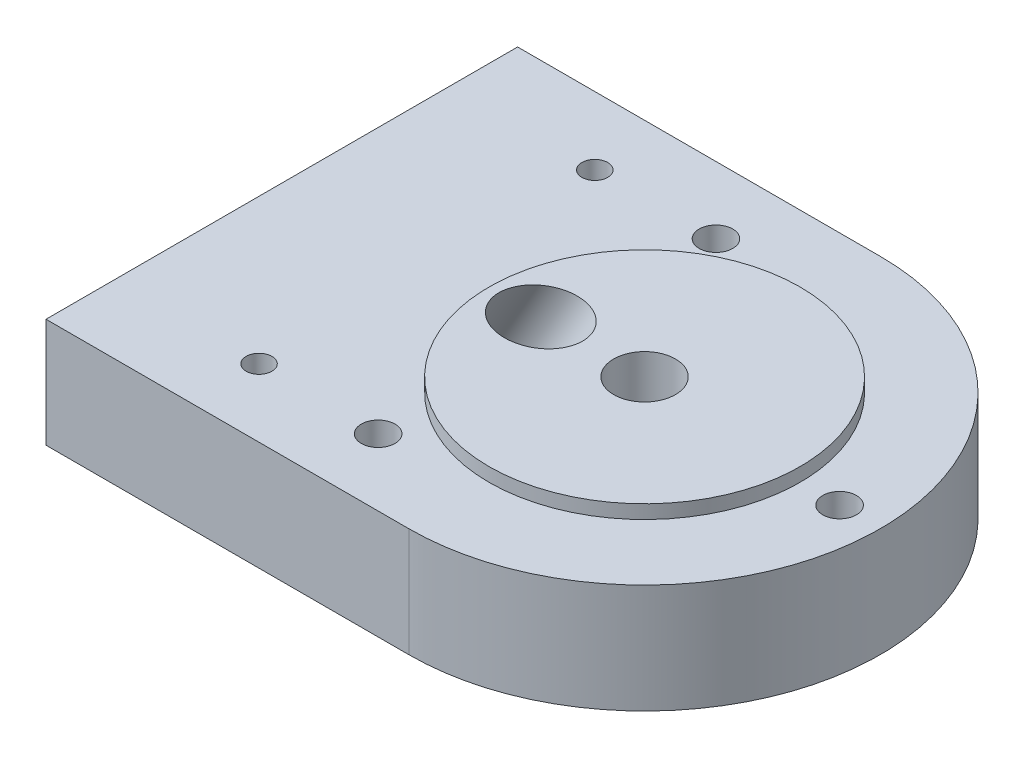
ISO-10303-21;
HEADER;
FILE_DESCRIPTION(('STEP AP214'),'2;1');
FILE_NAME('part.step','',(''),(''),'','','');
FILE_SCHEMA(('AUTOMOTIVE_DESIGN { 1 0 10303 214 1 1 1 1 }'));
ENDSEC;
DATA;
#1=APPLICATION_CONTEXT('core data for automotive mechanical design processes');
#2=APPLICATION_PROTOCOL_DEFINITION('international standard','automotive_design',2000,#1);
#3=PRODUCT_CONTEXT('',#1,'mechanical');
#4=PRODUCT('Part','Part','',(#3));
#5=PRODUCT_RELATED_PRODUCT_CATEGORY('part','',(#4));
#6=PRODUCT_DEFINITION_FORMATION('','',#4);
#7=PRODUCT_DEFINITION_CONTEXT('part definition',#1,'design');
#8=PRODUCT_DEFINITION('design','',#6,#7);
#9=PRODUCT_DEFINITION_SHAPE('','',#8);
#10=(LENGTH_UNIT() NAMED_UNIT(*) SI_UNIT(.MILLI.,.METRE.));
#11=(NAMED_UNIT(*) PLANE_ANGLE_UNIT() SI_UNIT($,.RADIAN.));
#12=(NAMED_UNIT(*) SI_UNIT($,.STERADIAN.) SOLID_ANGLE_UNIT());
#13=UNCERTAINTY_MEASURE_WITH_UNIT(LENGTH_MEASURE(1.E-05),#10,'distance_accuracy_value','');
#14=(GEOMETRIC_REPRESENTATION_CONTEXT(3) GLOBAL_UNCERTAINTY_ASSIGNED_CONTEXT((#13)) GLOBAL_UNIT_ASSIGNED_CONTEXT((#10,
#11,#12)) REPRESENTATION_CONTEXT('',''));
#15=CARTESIAN_POINT('',(0.,0.,0.));
#16=DIRECTION('',(0.,0.,1.));
#17=DIRECTION('',(1.,0.,0.));
#18=AXIS2_PLACEMENT_3D('',#15,#16,#17);
#19=CARTESIAN_POINT('',(31.7499999999999,0.,-20.6375));
#20=DIRECTION('',(0.,-1.,0.));
#21=DIRECTION('',(0.,0.,-1.));
#22=AXIS2_PLACEMENT_3D('',#19,#20,#21);
#23=CYLINDRICAL_SURFACE('',#22,2.7051);
#24=CARTESIAN_POINT('',(31.7499999999999,10.7442,-20.6375));
#25=DIRECTION('',(0.,-1.,0.));
#26=DIRECTION('',(0.,0.,-1.));
#27=AXIS2_PLACEMENT_3D('',#24,#25,#26);
#28=CIRCLE('',#27,2.70509999999999);
#29=CARTESIAN_POINT('',(31.7499999999999,10.7442,-23.3426));
#30=VERTEX_POINT('',#29);
#31=EDGE_CURVE('E129',#30,#30,#28,.T.);
#32=ORIENTED_EDGE('',*,*,#31,.F.);
#33=EDGE_LOOP('',(#32));
#34=FACE_BOUND('',#33,.T.);
#35=CARTESIAN_POINT('',(31.7499999999999,3.175,-20.6375));
#36=DIRECTION('',(0.,-1.,0.));
#37=DIRECTION('',(0.,0.,-1.));
#38=AXIS2_PLACEMENT_3D('',#35,#36,#37);
#39=CIRCLE('',#38,2.7051);
#40=CARTESIAN_POINT('',(31.7499999999999,3.175,-23.3426));
#41=VERTEX_POINT('',#40);
#42=EDGE_CURVE('E43',#41,#41,#39,.F.);
#43=ORIENTED_EDGE('',*,*,#42,.F.);
#44=EDGE_LOOP('',(#43));
#45=FACE_BOUND('',#44,.T.);
#46=ADVANCED_FACE('F39',(#34,#45),#23,.F.);
#47=CARTESIAN_POINT('',(0.,9.5504,0.));
#48=DIRECTION('',(1.,0.,0.));
#49=DIRECTION('',(0.,0.,-1.));
#50=AXIS2_PLACEMENT_3D('',#47,#48,#49);
#51=PLANE('',#50);
#52=CARTESIAN_POINT('',(0.,4.7752,-12.7));
#53=DIRECTION('',(-1.,0.,0.));
#54=DIRECTION('',(0.,0.,1.));
#55=AXIS2_PLACEMENT_3D('',#52,#53,#54);
#56=CIRCLE('',#55,1.35254999999999);
#57=CARTESIAN_POINT('',(0.,4.7752,-11.34745));
#58=VERTEX_POINT('',#57);
#59=EDGE_CURVE('E108',#58,#58,#56,.T.);
#60=ORIENTED_EDGE('',*,*,#59,.F.);
#61=EDGE_LOOP('',(#60));
#62=FACE_BOUND('',#61,.T.);
#63=CARTESIAN_POINT('',(0.,4.7752,-28.575));
#64=DIRECTION('',(-1.,0.,0.));
#65=DIRECTION('',(0.,0.,1.));
#66=AXIS2_PLACEMENT_3D('',#63,#64,#65);
#67=CIRCLE('',#66,1.35254999999999);
#68=CARTESIAN_POINT('',(0.,4.7752,-27.22245));
#69=VERTEX_POINT('',#68);
#70=EDGE_CURVE('E107',#69,#69,#67,.T.);
#71=ORIENTED_EDGE('',*,*,#70,.F.);
#72=EDGE_LOOP('',(#71));
#73=FACE_BOUND('',#72,.T.);
#74=DIRECTION('',(0.,0.,1.));
#75=VECTOR('',#74,1.);
#76=CARTESIAN_POINT('',(0.,0.,0.));
#77=LINE('',#76,#75);
#78=CARTESIAN_POINT('',(0.,0.,-41.275));
#79=VERTEX_POINT('',#78);
#80=CARTESIAN_POINT('',(0.,0.,0.));
#81=VERTEX_POINT('',#80);
#82=EDGE_CURVE('E162',#79,#81,#77,.T.);
#83=ORIENTED_EDGE('',*,*,#82,.T.);
#84=DIRECTION('',(0.,-1.,0.));
#85=VECTOR('',#84,1.);
#86=CARTESIAN_POINT('',(0.,9.5504,0.));
#87=LINE('',#86,#85);
#88=CARTESIAN_POINT('',(0.,9.5504,0.));
#89=VERTEX_POINT('',#88);
#90=EDGE_CURVE('E49',#89,#81,#87,.T.);
#91=ORIENTED_EDGE('',*,*,#90,.F.);
#92=DIRECTION('',(0.,0.,1.));
#93=VECTOR('',#92,1.);
#94=CARTESIAN_POINT('',(0.,9.5504,0.));
#95=LINE('',#94,#93);
#96=CARTESIAN_POINT('',(0.,9.5504,-41.275));
#97=VERTEX_POINT('',#96);
#98=EDGE_CURVE('E164',#97,#89,#95,.T.);
#99=ORIENTED_EDGE('',*,*,#98,.F.);
#100=DIRECTION('',(0.,-1.,0.));
#101=VECTOR('',#100,1.);
#102=CARTESIAN_POINT('',(0.,9.5504,-41.275));
#103=LINE('',#102,#101);
#104=EDGE_CURVE('E170',#97,#79,#103,.T.);
#105=ORIENTED_EDGE('',*,*,#104,.T.);
#106=EDGE_LOOP('',(#83,#91,#99,#105));
#107=FACE_BOUND('',#106,.T.);
#108=ADVANCED_FACE('F41',(#62,#73,#107),#51,.F.);
#109=CARTESIAN_POINT('',(0.,9.5504,0.));
#110=DIRECTION('',(0.,0.,-1.));
#111=DIRECTION('',(-1.,0.,0.));
#112=AXIS2_PLACEMENT_3D('',#109,#110,#111);
#113=PLANE('',#112);
#114=DIRECTION('',(1.,0.,0.));
#115=VECTOR('',#114,1.);
#116=CARTESIAN_POINT('',(0.,0.,0.));
#117=LINE('',#116,#115);
#118=CARTESIAN_POINT('',(31.75,0.,0.));
#119=VERTEX_POINT('',#118);
#120=EDGE_CURVE('E173',#81,#119,#117,.T.);
#121=ORIENTED_EDGE('',*,*,#120,.T.);
#122=DIRECTION('',(0.,-1.,0.));
#123=VECTOR('',#122,1.);
#124=CARTESIAN_POINT('',(31.75,9.5504,0.));
#125=LINE('',#124,#123);
#126=CARTESIAN_POINT('',(31.75,9.5504,0.));
#127=VERTEX_POINT('',#126);
#128=EDGE_CURVE('E180',#127,#119,#125,.T.);
#129=ORIENTED_EDGE('',*,*,#128,.F.);
#130=DIRECTION('',(1.,0.,0.));
#131=VECTOR('',#130,1.);
#132=CARTESIAN_POINT('',(0.,9.5504,0.));
#133=LINE('',#132,#131);
#134=EDGE_CURVE('E90',#89,#127,#133,.T.);
#135=ORIENTED_EDGE('',*,*,#134,.F.);
#136=ORIENTED_EDGE('',*,*,#90,.T.);
#137=EDGE_LOOP('',(#121,#129,#135,#136));
#138=FACE_BOUND('',#137,.T.);
#139=ADVANCED_FACE('F200',(#138),#113,.F.);
#140=CARTESIAN_POINT('',(31.75,9.5504,-20.6375));
#141=DIRECTION('',(0.,-1.,0.));
#142=DIRECTION('',(0.,0.,-1.));
#143=AXIS2_PLACEMENT_3D('',#140,#141,#142);
#144=CYLINDRICAL_SURFACE('',#143,20.6375);
#145=CARTESIAN_POINT('',(31.75,0.,-20.6375));
#146=DIRECTION('',(0.,1.,0.));
#147=DIRECTION('',(0.,0.,-1.));
#148=AXIS2_PLACEMENT_3D('',#145,#146,#147);
#149=CIRCLE('',#148,20.6375);
#150=CARTESIAN_POINT('',(31.75,0.,-41.275));
#151=VERTEX_POINT('',#150);
#152=EDGE_CURVE('E76',#119,#151,#149,.T.);
#153=ORIENTED_EDGE('',*,*,#152,.T.);
#154=DIRECTION('',(0.,-1.,0.));
#155=VECTOR('',#154,1.);
#156=CARTESIAN_POINT('',(31.75,9.5504,-41.275));
#157=LINE('',#156,#155);
#158=CARTESIAN_POINT('',(31.75,9.5504,-41.275));
#159=VERTEX_POINT('',#158);
#160=EDGE_CURVE('E178',#159,#151,#157,.T.);
#161=ORIENTED_EDGE('',*,*,#160,.F.);
#162=CARTESIAN_POINT('',(31.75,9.5504,-20.6375));
#163=DIRECTION('',(0.,1.,0.));
#164=DIRECTION('',(0.,0.,-1.));
#165=AXIS2_PLACEMENT_3D('',#162,#163,#164);
#166=CIRCLE('',#165,20.6375);
#167=EDGE_CURVE('E167',#127,#159,#166,.T.);
#168=ORIENTED_EDGE('',*,*,#167,.F.);
#169=ORIENTED_EDGE('',*,*,#128,.T.);
#170=EDGE_LOOP('',(#153,#161,#168,#169));
#171=FACE_BOUND('',#170,.T.);
#172=ADVANCED_FACE('F246',(#171),#144,.T.);
#173=CARTESIAN_POINT('',(0.,9.5504,-41.275));
#174=DIRECTION('',(0.,0.,1.));
#175=DIRECTION('',(1.,0.,0.));
#176=AXIS2_PLACEMENT_3D('',#173,#174,#175);
#177=PLANE('',#176);
#178=DIRECTION('',(-1.,0.,0.));
#179=VECTOR('',#178,1.);
#180=CARTESIAN_POINT('',(0.,0.,-41.275));
#181=LINE('',#180,#179);
#182=EDGE_CURVE('E82',#151,#79,#181,.T.);
#183=ORIENTED_EDGE('',*,*,#182,.T.);
#184=ORIENTED_EDGE('',*,*,#104,.F.);
#185=DIRECTION('',(-1.,0.,0.));
#186=VECTOR('',#185,1.);
#187=CARTESIAN_POINT('',(0.,9.5504,-41.275));
#188=LINE('',#187,#186);
#189=EDGE_CURVE('E58',#159,#97,#188,.T.);
#190=ORIENTED_EDGE('',*,*,#189,.F.);
#191=ORIENTED_EDGE('',*,*,#160,.T.);
#192=EDGE_LOOP('',(#183,#184,#190,#191));
#193=FACE_BOUND('',#192,.T.);
#194=ADVANCED_FACE('F239',(#193),#177,.F.);
#195=CARTESIAN_POINT('',(31.75,9.5504,-20.6375));
#196=DIRECTION('',(0.,-1.,0.));
#197=DIRECTION('',(0.,0.,-1.));
#198=AXIS2_PLACEMENT_3D('',#195,#196,#197);
#199=PLANE('',#198);
#200=CARTESIAN_POINT('',(12.7,9.5504,-5.9436));
#201=DIRECTION('',(0.,-1.,0.));
#202=DIRECTION('',(0.,0.,-1.));
#203=AXIS2_PLACEMENT_3D('',#200,#201,#202);
#204=CIRCLE('',#203,1.1303);
#205=CARTESIAN_POINT('',(12.7,9.5504,-7.0739));
#206=VERTEX_POINT('',#205);
#207=EDGE_CURVE('E135',#206,#206,#204,.T.);
#208=ORIENTED_EDGE('',*,*,#207,.T.);
#209=EDGE_LOOP('',(#208));
#210=FACE_BOUND('',#209,.T.);
#211=CARTESIAN_POINT('',(12.7,9.5504,-35.3314));
#212=DIRECTION('',(0.,-1.,0.));
#213=DIRECTION('',(0.,0.,-1.));
#214=AXIS2_PLACEMENT_3D('',#211,#212,#213);
#215=CIRCLE('',#214,1.1303);
#216=CARTESIAN_POINT('',(12.7,9.5504,-36.4617));
#217=VERTEX_POINT('',#216);
#218=EDGE_CURVE('E139',#217,#217,#215,.T.);
#219=ORIENTED_EDGE('',*,*,#218,.T.);
#220=EDGE_LOOP('',(#219));
#221=FACE_BOUND('',#220,.T.);
#222=CARTESIAN_POINT('',(23.2156,9.5504,-35.4203));
#223=DIRECTION('',(0.,-1.,0.));
#224=DIRECTION('',(0.,0.,-1.));
#225=AXIS2_PLACEMENT_3D('',#222,#223,#224);
#226=CIRCLE('',#225,1.4732);
#227=CARTESIAN_POINT('',(23.2156,9.5504,-36.8935));
#228=VERTEX_POINT('',#227);
#229=EDGE_CURVE('E157',#228,#228,#226,.T.);
#230=ORIENTED_EDGE('',*,*,#229,.T.);
#231=EDGE_LOOP('',(#230));
#232=FACE_BOUND('',#231,.T.);
#233=CARTESIAN_POINT('',(48.8188,9.5504,-20.6375));
#234=DIRECTION('',(0.,-1.,0.));
#235=DIRECTION('',(0.,0.,-1.));
#236=AXIS2_PLACEMENT_3D('',#233,#234,#235);
#237=CIRCLE('',#236,1.4732);
#238=CARTESIAN_POINT('',(48.8188,9.5504,-22.1107));
#239=VERTEX_POINT('',#238);
#240=EDGE_CURVE('E154',#239,#239,#237,.T.);
#241=ORIENTED_EDGE('',*,*,#240,.T.);
#242=EDGE_LOOP('',(#241));
#243=FACE_BOUND('',#242,.T.);
#244=CARTESIAN_POINT('',(23.2156,9.5504,-5.8547));
#245=DIRECTION('',(0.,-1.,0.));
#246=DIRECTION('',(0.,0.,-1.));
#247=AXIS2_PLACEMENT_3D('',#244,#245,#246);
#248=CIRCLE('',#247,1.4732);
#249=CARTESIAN_POINT('',(23.2156,9.5504,-7.3279));
#250=VERTEX_POINT('',#249);
#251=EDGE_CURVE('E146',#250,#250,#248,.T.);
#252=ORIENTED_EDGE('',*,*,#251,.T.);
#253=EDGE_LOOP('',(#252));
#254=FACE_BOUND('',#253,.T.);
#255=CARTESIAN_POINT('',(31.75,9.5504,-20.6375));
#256=DIRECTION('',(0.,1.,0.));
#257=DIRECTION('',(0.,0.,1.));
#258=AXIS2_PLACEMENT_3D('',#255,#256,#257);
#259=CIRCLE('',#258,13.6144);
#260=CARTESIAN_POINT('',(31.75,9.5504,-7.0231));
#261=VERTEX_POINT('',#260);
#262=EDGE_CURVE('E11',#261,#261,#259,.T.);
#263=ORIENTED_EDGE('',*,*,#262,.F.);
#264=EDGE_LOOP('',(#263));
#265=FACE_BOUND('',#264,.T.);
#266=ORIENTED_EDGE('',*,*,#98,.T.);
#267=ORIENTED_EDGE('',*,*,#134,.T.);
#268=ORIENTED_EDGE('',*,*,#167,.T.);
#269=ORIENTED_EDGE('',*,*,#189,.T.);
#270=EDGE_LOOP('',(#266,#267,#268,#269));
#271=FACE_BOUND('',#270,.T.);
#272=ADVANCED_FACE('F236',(#210,#221,#232,#243,#254,#265,#271),#199,.F.);
#273=CARTESIAN_POINT('',(31.75,0.,-20.6375));
#274=DIRECTION('',(0.,-1.,0.));
#275=DIRECTION('',(0.,0.,-1.));
#276=AXIS2_PLACEMENT_3D('',#273,#274,#275);
#277=PLANE('',#276);
#278=CARTESIAN_POINT('',(16.4638029065819,0.,-20.6375));
#279=DIRECTION('',(0.,-1.,0.));
#280=DIRECTION('',(-1.,0.,0.));
#281=AXIS2_PLACEMENT_3D('',#278,#279,#280);
#282=ELLIPSE('',#281,3.66617420935412,3.175);
#283=CARTESIAN_POINT('',(12.7976286972278,0.,-20.6375));
#284=VERTEX_POINT('',#283);
#285=EDGE_CURVE('E122',#284,#284,#282,.F.);
#286=ORIENTED_EDGE('',*,*,#285,.T.);
#287=EDGE_LOOP('',(#286));
#288=FACE_BOUND('',#287,.T.);
#289=CARTESIAN_POINT('',(31.7499999999999,0.,-20.6375));
#290=DIRECTION('',(0.,-1.,0.));
#291=DIRECTION('',(0.,0.,-1.));
#292=AXIS2_PLACEMENT_3D('',#289,#290,#291);
#293=CIRCLE('',#292,3.683);
#294=CARTESIAN_POINT('',(31.7499999999999,0.,-24.3205));
#295=VERTEX_POINT('',#294);
#296=EDGE_CURVE('E125',#295,#295,#293,.T.);
#297=ORIENTED_EDGE('',*,*,#296,.F.);
#298=EDGE_LOOP('',(#297));
#299=FACE_BOUND('',#298,.T.);
#300=CARTESIAN_POINT('',(12.7,0.,-5.9436));
#301=DIRECTION('',(0.,-1.,0.));
#302=DIRECTION('',(0.,0.,-1.));
#303=AXIS2_PLACEMENT_3D('',#300,#301,#302);
#304=CIRCLE('',#303,1.1303);
#305=CARTESIAN_POINT('',(12.7,0.,-7.0739));
#306=VERTEX_POINT('',#305);
#307=EDGE_CURVE('E132',#306,#306,#304,.T.);
#308=ORIENTED_EDGE('',*,*,#307,.F.);
#309=EDGE_LOOP('',(#308));
#310=FACE_BOUND('',#309,.T.);
#311=CARTESIAN_POINT('',(12.7,0.,-35.3314));
#312=DIRECTION('',(0.,-1.,0.));
#313=DIRECTION('',(0.,0.,-1.));
#314=AXIS2_PLACEMENT_3D('',#311,#312,#313);
#315=CIRCLE('',#314,1.1303);
#316=CARTESIAN_POINT('',(12.7,0.,-36.4617));
#317=VERTEX_POINT('',#316);
#318=EDGE_CURVE('E136',#317,#317,#315,.T.);
#319=ORIENTED_EDGE('',*,*,#318,.F.);
#320=EDGE_LOOP('',(#319));
#321=FACE_BOUND('',#320,.T.);
#322=CARTESIAN_POINT('',(23.2156,0.,-35.4203));
#323=DIRECTION('',(0.,1.,0.));
#324=DIRECTION('',(0.,0.,1.));
#325=AXIS2_PLACEMENT_3D('',#322,#323,#324);
#326=CIRCLE('',#325,1.4732);
#327=CARTESIAN_POINT('',(23.2156,0.,-33.9471));
#328=VERTEX_POINT('',#327);
#329=EDGE_CURVE('E143',#328,#328,#326,.T.);
#330=ORIENTED_EDGE('',*,*,#329,.T.);
#331=EDGE_LOOP('',(#330));
#332=FACE_BOUND('',#331,.T.);
#333=CARTESIAN_POINT('',(48.8188,0.,-20.6375));
#334=DIRECTION('',(0.,1.,0.));
#335=DIRECTION('',(0.,0.,1.));
#336=AXIS2_PLACEMENT_3D('',#333,#334,#335);
#337=CIRCLE('',#336,1.4732);
#338=CARTESIAN_POINT('',(48.8188,0.,-19.1643));
#339=VERTEX_POINT('',#338);
#340=EDGE_CURVE('E147',#339,#339,#337,.T.);
#341=ORIENTED_EDGE('',*,*,#340,.T.);
#342=EDGE_LOOP('',(#341));
#343=FACE_BOUND('',#342,.T.);
#344=CARTESIAN_POINT('',(23.2156,0.,-5.8547));
#345=DIRECTION('',(0.,1.,0.));
#346=DIRECTION('',(0.,0.,1.));
#347=AXIS2_PLACEMENT_3D('',#344,#345,#346);
#348=CIRCLE('',#347,1.4732);
#349=CARTESIAN_POINT('',(23.2156,0.,-4.3815));
#350=VERTEX_POINT('',#349);
#351=EDGE_CURVE('E142',#350,#350,#348,.T.);
#352=ORIENTED_EDGE('',*,*,#351,.T.);
#353=EDGE_LOOP('',(#352));
#354=FACE_BOUND('',#353,.T.);
#355=ORIENTED_EDGE('',*,*,#82,.F.);
#356=ORIENTED_EDGE('',*,*,#182,.F.);
#357=ORIENTED_EDGE('',*,*,#152,.F.);
#358=ORIENTED_EDGE('',*,*,#120,.F.);
#359=EDGE_LOOP('',(#355,#356,#357,#358));
#360=FACE_BOUND('',#359,.T.);
#361=ADVANCED_FACE('F234',(#288,#299,#310,#321,#332,#343,#354,#360),#277,.T.);
#362=CARTESIAN_POINT('',(31.75,10.7442,-20.6375));
#363=DIRECTION('',(0.,-1.,0.));
#364=DIRECTION('',(0.,0.,-1.));
#365=AXIS2_PLACEMENT_3D('',#362,#363,#364);
#366=CYLINDRICAL_SURFACE('',#365,13.6144);
#367=CARTESIAN_POINT('',(31.75,10.7442,-20.6375));
#368=DIRECTION('',(0.,1.,0.));
#369=DIRECTION('',(0.,0.,1.));
#370=AXIS2_PLACEMENT_3D('',#367,#368,#369);
#371=CIRCLE('',#370,13.6144);
#372=CARTESIAN_POINT('',(31.75,10.7442,-7.0231));
#373=VERTEX_POINT('',#372);
#374=EDGE_CURVE('E160',#373,#373,#371,.T.);
#375=ORIENTED_EDGE('',*,*,#374,.F.);
#376=EDGE_LOOP('',(#375));
#377=FACE_BOUND('',#376,.T.);
#378=ORIENTED_EDGE('',*,*,#262,.T.);
#379=EDGE_LOOP('',(#378));
#380=FACE_BOUND('',#379,.T.);
#381=ADVANCED_FACE('F230',(#377,#380),#366,.T.);
#382=CARTESIAN_POINT('',(31.75,10.7442,-20.6375));
#383=DIRECTION('',(0.,1.,0.));
#384=DIRECTION('',(0.,0.,1.));
#385=AXIS2_PLACEMENT_3D('',#382,#383,#384);
#386=PLANE('',#385);
#387=CARTESIAN_POINT('',(22.666969668809,10.7442,-20.6375));
#388=DIRECTION('',(0.,1.,0.));
#389=DIRECTION('',(-1.,0.,0.));
#390=AXIS2_PLACEMENT_3D('',#387,#388,#389);
#391=ELLIPSE('',#390,3.66617420935412,3.175);
#392=CARTESIAN_POINT('',(19.0007954594549,10.7442,-20.6375));
#393=VERTEX_POINT('',#392);
#394=EDGE_CURVE('E126',#393,#393,#391,.F.);
#395=ORIENTED_EDGE('',*,*,#394,.T.);
#396=EDGE_LOOP('',(#395));
#397=FACE_BOUND('',#396,.T.);
#398=ORIENTED_EDGE('',*,*,#31,.T.);
#399=EDGE_LOOP('',(#398));
#400=FACE_BOUND('',#399,.T.);
#401=ORIENTED_EDGE('',*,*,#374,.T.);
#402=EDGE_LOOP('',(#401));
#403=FACE_BOUND('',#402,.T.);
#404=ADVANCED_FACE('F226',(#397,#400,#403),#386,.T.);
#405=CARTESIAN_POINT('',(23.2156,0.,-5.8547));
#406=DIRECTION('',(0.,1.,0.));
#407=DIRECTION('',(0.,0.,1.));
#408=AXIS2_PLACEMENT_3D('',#405,#406,#407);
#409=CYLINDRICAL_SURFACE('',#408,1.4732);
#410=ORIENTED_EDGE('',*,*,#351,.F.);
#411=EDGE_LOOP('',(#410));
#412=FACE_BOUND('',#411,.T.);
#413=ORIENTED_EDGE('',*,*,#251,.F.);
#414=EDGE_LOOP('',(#413));
#415=FACE_BOUND('',#414,.T.);
#416=ADVANCED_FACE('F222',(#412,#415),#409,.F.);
#417=CARTESIAN_POINT('',(48.8188,0.,-20.6375));
#418=DIRECTION('',(0.,1.,0.));
#419=DIRECTION('',(0.,0.,1.));
#420=AXIS2_PLACEMENT_3D('',#417,#418,#419);
#421=CYLINDRICAL_SURFACE('',#420,1.4732);
#422=ORIENTED_EDGE('',*,*,#340,.F.);
#423=EDGE_LOOP('',(#422));
#424=FACE_BOUND('',#423,.T.);
#425=ORIENTED_EDGE('',*,*,#240,.F.);
#426=EDGE_LOOP('',(#425));
#427=FACE_BOUND('',#426,.T.);
#428=ADVANCED_FACE('F218',(#424,#427),#421,.F.);
#429=CARTESIAN_POINT('',(23.2156,0.,-35.4203));
#430=DIRECTION('',(0.,1.,0.));
#431=DIRECTION('',(0.,0.,1.));
#432=AXIS2_PLACEMENT_3D('',#429,#430,#431);
#433=CYLINDRICAL_SURFACE('',#432,1.4732);
#434=ORIENTED_EDGE('',*,*,#329,.F.);
#435=EDGE_LOOP('',(#434));
#436=FACE_BOUND('',#435,.T.);
#437=ORIENTED_EDGE('',*,*,#229,.F.);
#438=EDGE_LOOP('',(#437));
#439=FACE_BOUND('',#438,.T.);
#440=ADVANCED_FACE('F214',(#436,#439),#433,.F.);
#441=CARTESIAN_POINT('',(12.7,0.,-35.3314));
#442=DIRECTION('',(0.,-1.,0.));
#443=DIRECTION('',(0.,0.,-1.));
#444=AXIS2_PLACEMENT_3D('',#441,#442,#443);
#445=CYLINDRICAL_SURFACE('',#444,1.1303);
#446=ORIENTED_EDGE('',*,*,#318,.T.);
#447=EDGE_LOOP('',(#446));
#448=FACE_BOUND('',#447,.T.);
#449=ORIENTED_EDGE('',*,*,#218,.F.);
#450=EDGE_LOOP('',(#449));
#451=FACE_BOUND('',#450,.T.);
#452=ADVANCED_FACE('F210',(#448,#451),#445,.F.);
#453=CARTESIAN_POINT('',(12.7,0.,-5.9436));
#454=DIRECTION('',(0.,-1.,0.));
#455=DIRECTION('',(0.,0.,-1.));
#456=AXIS2_PLACEMENT_3D('',#453,#454,#455);
#457=CYLINDRICAL_SURFACE('',#456,1.1303);
#458=ORIENTED_EDGE('',*,*,#307,.T.);
#459=EDGE_LOOP('',(#458));
#460=FACE_BOUND('',#459,.T.);
#461=ORIENTED_EDGE('',*,*,#207,.F.);
#462=EDGE_LOOP('',(#461));
#463=FACE_BOUND('',#462,.T.);
#464=ADVANCED_FACE('F207',(#460,#463),#457,.F.);
#465=CARTESIAN_POINT('',(31.7499999999999,0.,-20.6375));
#466=DIRECTION('',(0.,-1.,0.));
#467=DIRECTION('',(0.,0.,-1.));
#468=AXIS2_PLACEMENT_3D('',#465,#466,#467);
#469=CONICAL_SURFACE('',#468,3.683,0.715584993317674);
#470=CARTESIAN_POINT('',(31.7499999999999,0.584387150868275,-20.6375));
#471=DIRECTION('',(0.,-1.,0.));
#472=DIRECTION('',(0.,0.,-1.));
#473=AXIS2_PLACEMENT_3D('',#470,#471,#472);
#474=CIRCLE('',#473,3.175);
#475=CARTESIAN_POINT('',(31.7499999999999,0.584387150868275,-23.8125));
#476=VERTEX_POINT('',#475);
#477=EDGE_CURVE('E121',#476,#476,#474,.F.);
#478=ORIENTED_EDGE('',*,*,#477,.T.);
#479=EDGE_LOOP('',(#478));
#480=FACE_BOUND('',#479,.T.);
#481=ORIENTED_EDGE('',*,*,#296,.T.);
#482=EDGE_LOOP('',(#481));
#483=FACE_BOUND('',#482,.T.);
#484=ADVANCED_FACE('F205',(#480,#483),#469,.F.);
#485=CARTESIAN_POINT('',(30.0971022516067,23.6135671403786,-20.6375));
#486=DIRECTION('',(-0.499999999999998,-0.86602540378444,0.));
#487=DIRECTION('',(0.86602540378444,-0.499999999999998,0.));
#488=AXIS2_PLACEMENT_3D('',#485,#486,#487);
#489=CYLINDRICAL_SURFACE('',#488,3.175);
#490=ORIENTED_EDGE('',*,*,#285,.F.);
#491=EDGE_LOOP('',(#490));
#492=FACE_BOUND('',#491,.T.);
#493=ORIENTED_EDGE('',*,*,#394,.F.);
#494=EDGE_LOOP('',(#493));
#495=FACE_BOUND('',#494,.T.);
#496=ADVANCED_FACE('F310',(#492,#495),#489,.F.);
#497=CARTESIAN_POINT('',(31.7499999999999,3.175,-20.6375));
#498=DIRECTION('',(0.,-1.,0.));
#499=DIRECTION('',(0.,0.,-1.));
#500=AXIS2_PLACEMENT_3D('',#497,#498,#499);
#501=PLANE('',#500);
#502=CARTESIAN_POINT('',(31.7499999999999,3.175,-20.6375));
#503=DIRECTION('',(0.,-1.,0.));
#504=DIRECTION('',(0.,0.,-1.));
#505=AXIS2_PLACEMENT_3D('',#502,#503,#504);
#506=CIRCLE('',#505,3.175);
#507=CARTESIAN_POINT('',(31.7499999999999,3.175,-23.8125));
#508=VERTEX_POINT('',#507);
#509=EDGE_CURVE('E118',#508,#508,#506,.T.);
#510=ORIENTED_EDGE('',*,*,#509,.T.);
#511=EDGE_LOOP('',(#510));
#512=FACE_BOUND('',#511,.T.);
#513=ORIENTED_EDGE('',*,*,#42,.T.);
#514=EDGE_LOOP('',(#513));
#515=FACE_BOUND('',#514,.T.);
#516=ADVANCED_FACE('F192',(#512,#515),#501,.T.);
#517=CARTESIAN_POINT('',(31.7499999999999,3.175,-20.6375));
#518=DIRECTION('',(0.,-1.,0.));
#519=DIRECTION('',(0.,0.,-1.));
#520=AXIS2_PLACEMENT_3D('',#517,#518,#519);
#521=CYLINDRICAL_SURFACE('',#520,3.175);
#522=ORIENTED_EDGE('',*,*,#509,.F.);
#523=EDGE_LOOP('',(#522));
#524=FACE_BOUND('',#523,.T.);
#525=ORIENTED_EDGE('',*,*,#477,.F.);
#526=EDGE_LOOP('',(#525));
#527=FACE_BOUND('',#526,.T.);
#528=ADVANCED_FACE('F323',(#524,#527),#521,.F.);
#529=CARTESIAN_POINT('',(9.52500000000001,4.7752,-28.575));
#530=DIRECTION('',(-1.,0.,0.));
#531=DIRECTION('',(0.,0.,1.));
#532=AXIS2_PLACEMENT_3D('',#529,#530,#531);
#533=CONICAL_SURFACE('',#532,1.35254999999999,1.02974425867665);
#534=CARTESIAN_POINT('',(10.3376940302657,4.7752,-28.575));
#535=VERTEX_POINT('',#534);
#536=VERTEX_LOOP('',#535);
#537=FACE_BOUND('',#536,.T.);
#538=CARTESIAN_POINT('',(9.52500000000001,4.7752,-28.575));
#539=DIRECTION('',(-1.,0.,0.));
#540=DIRECTION('',(0.,0.,1.));
#541=AXIS2_PLACEMENT_3D('',#538,#539,#540);
#542=CIRCLE('',#541,1.35254999999999);
#543=CARTESIAN_POINT('',(9.52500000000001,4.7752,-27.22245));
#544=VERTEX_POINT('',#543);
#545=EDGE_CURVE('E111',#544,#544,#542,.T.);
#546=ORIENTED_EDGE('',*,*,#545,.T.);
#547=EDGE_LOOP('',(#546));
#548=FACE_BOUND('',#547,.T.);
#549=ADVANCED_FACE('F331',(#537,#548),#533,.F.);
#550=CARTESIAN_POINT('',(0.,4.7752,-28.575));
#551=DIRECTION('',(-1.,0.,0.));
#552=DIRECTION('',(0.,0.,1.));
#553=AXIS2_PLACEMENT_3D('',#550,#551,#552);
#554=CYLINDRICAL_SURFACE('',#553,1.35254999999999);
#555=ORIENTED_EDGE('',*,*,#545,.F.);
#556=EDGE_LOOP('',(#555));
#557=FACE_BOUND('',#556,.T.);
#558=ORIENTED_EDGE('',*,*,#70,.T.);
#559=EDGE_LOOP('',(#558));
#560=FACE_BOUND('',#559,.T.);
#561=ADVANCED_FACE('F101',(#557,#560),#554,.F.);
#562=CARTESIAN_POINT('',(9.52500000000001,4.7752,-12.7));
#563=DIRECTION('',(-1.,0.,0.));
#564=DIRECTION('',(0.,0.,1.));
#565=AXIS2_PLACEMENT_3D('',#562,#563,#564);
#566=CONICAL_SURFACE('',#565,1.35254999999999,1.02974425867665);
#567=CARTESIAN_POINT('',(10.3376940302657,4.7752,-12.7));
#568=VERTEX_POINT('',#567);
#569=VERTEX_LOOP('',#568);
#570=FACE_BOUND('',#569,.T.);
#571=CARTESIAN_POINT('',(9.52500000000001,4.7752,-12.7));
#572=DIRECTION('',(-1.,0.,0.));
#573=DIRECTION('',(0.,0.,1.));
#574=AXIS2_PLACEMENT_3D('',#571,#572,#573);
#575=CIRCLE('',#574,1.35254999999999);
#576=CARTESIAN_POINT('',(9.52500000000001,4.7752,-11.34745));
#577=VERTEX_POINT('',#576);
#578=EDGE_CURVE('E105',#577,#577,#575,.T.);
#579=ORIENTED_EDGE('',*,*,#578,.T.);
#580=EDGE_LOOP('',(#579));
#581=FACE_BOUND('',#580,.T.);
#582=ADVANCED_FACE('F97',(#570,#581),#566,.F.);
#583=CARTESIAN_POINT('',(0.,4.7752,-12.7));
#584=DIRECTION('',(-1.,0.,0.));
#585=DIRECTION('',(0.,0.,1.));
#586=AXIS2_PLACEMENT_3D('',#583,#584,#585);
#587=CYLINDRICAL_SURFACE('',#586,1.35254999999999);
#588=ORIENTED_EDGE('',*,*,#578,.F.);
#589=EDGE_LOOP('',(#588));
#590=FACE_BOUND('',#589,.T.);
#591=ORIENTED_EDGE('',*,*,#59,.T.);
#592=EDGE_LOOP('',(#591));
#593=FACE_BOUND('',#592,.T.);
#594=ADVANCED_FACE('F100',(#590,#593),#587,.F.);
#595=CLOSED_SHELL('',(#46,#108,#139,#172,#194,#272,#361,#381,#404,#416,#428,#440,#452,#464,#484,
#496,#516,#528,#549,#561,#582,#594));
#596=MANIFOLD_SOLID_BREP('B2',#595);
#597=ADVANCED_BREP_SHAPE_REPRESENTATION('',(#18,#596),#14);
#598=SHAPE_DEFINITION_REPRESENTATION(#9,#597);
ENDSEC;
END-ISO-10303-21;
